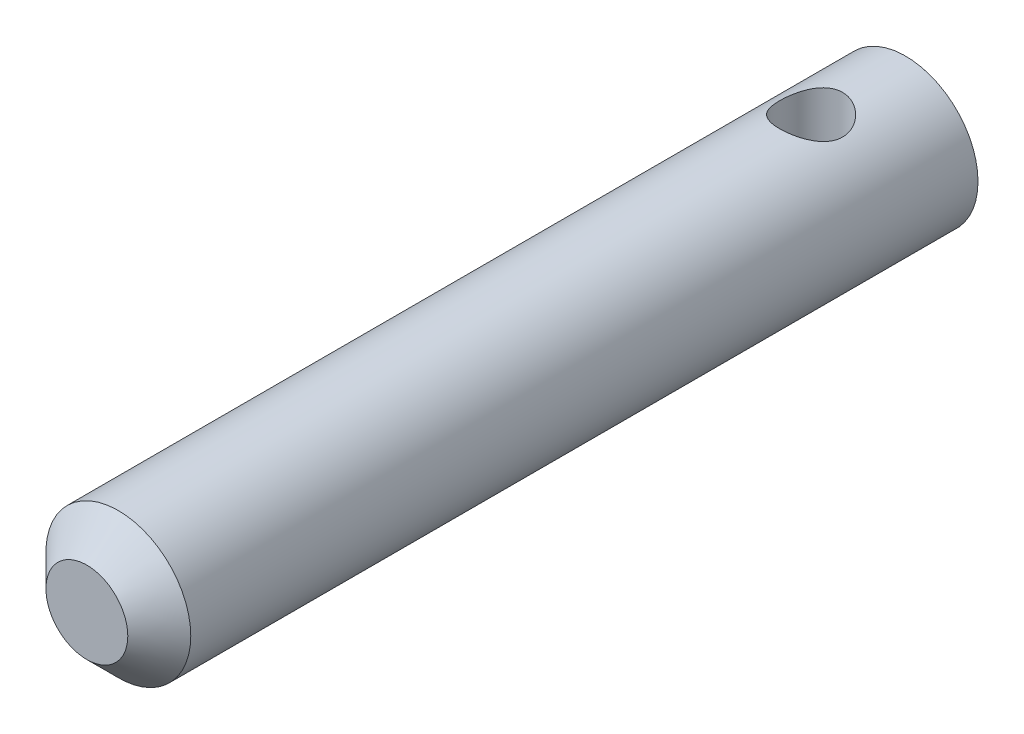
ISO-10303-21;
HEADER;
FILE_DESCRIPTION(('STEP AP214'),'2;1');
FILE_NAME('part.step','',(''),(''),'','','');
FILE_SCHEMA(('AUTOMOTIVE_DESIGN { 1 0 10303 214 1 1 1 1 }'));
ENDSEC;
DATA;
#1=APPLICATION_CONTEXT('core data for automotive mechanical design processes');
#2=APPLICATION_PROTOCOL_DEFINITION('international standard','automotive_design',2000,#1);
#3=PRODUCT_CONTEXT('',#1,'mechanical');
#4=PRODUCT('Part','Part','',(#3));
#5=PRODUCT_RELATED_PRODUCT_CATEGORY('part','',(#4));
#6=PRODUCT_DEFINITION_FORMATION('','',#4);
#7=PRODUCT_DEFINITION_CONTEXT('part definition',#1,'design');
#8=PRODUCT_DEFINITION('design','',#6,#7);
#9=PRODUCT_DEFINITION_SHAPE('','',#8);
#10=(LENGTH_UNIT() NAMED_UNIT(*) SI_UNIT(.MILLI.,.METRE.));
#11=(NAMED_UNIT(*) PLANE_ANGLE_UNIT() SI_UNIT($,.RADIAN.));
#12=(NAMED_UNIT(*) SI_UNIT($,.STERADIAN.) SOLID_ANGLE_UNIT());
#13=UNCERTAINTY_MEASURE_WITH_UNIT(LENGTH_MEASURE(1.E-05),#10,'distance_accuracy_value','');
#14=(GEOMETRIC_REPRESENTATION_CONTEXT(3) GLOBAL_UNCERTAINTY_ASSIGNED_CONTEXT((#13)) GLOBAL_UNIT_ASSIGNED_CONTEXT((#10,
#11,#12)) REPRESENTATION_CONTEXT('',''));
#15=CARTESIAN_POINT('',(0.,0.,0.));
#16=DIRECTION('',(0.,0.,1.));
#17=DIRECTION('',(1.,0.,0.));
#18=AXIS2_PLACEMENT_3D('',#15,#16,#17);
#19=CARTESIAN_POINT('',(0.,0.,130.));
#20=DIRECTION('',(0.,0.,-1.));
#21=DIRECTION('',(-1.,0.,0.));
#22=AXIS2_PLACEMENT_3D('',#19,#20,#21);
#23=CYLINDRICAL_SURFACE('',#22,11.5);
#24=CARTESIAN_POINT('',(0.,-11.5,20.));
#25=CARTESIAN_POINT('',(0.133458990074249,-11.4999991874002,19.9999990124654));
#26=CARTESIAN_POINT('',(0.266955948786075,-11.4976705721475,19.9946495135016));
#27=CARTESIAN_POINT('',(0.532992536445056,-11.4884139669808,19.9733032570884));
#28=CARTESIAN_POINT('',(0.665531550451407,-11.4814832492198,19.9573001848328));
#29=CARTESIAN_POINT('',(0.928868465690383,-11.4631869092443,19.9147760227048));
#30=CARTESIAN_POINT('',(1.05966248689034,-11.4518127026574,19.8882345721142));
#31=CARTESIAN_POINT('',(1.31835845187226,-11.4249225631695,19.8249017093118));
#32=CARTESIAN_POINT('',(1.44625919029645,-11.4094049373525,19.7881061071953));
#33=CARTESIAN_POINT('',(1.69777130312297,-11.3746919849332,19.7047897934512));
#34=CARTESIAN_POINT('',(1.8213976229545,-11.3555114250592,19.658308064039));
#35=CARTESIAN_POINT('',(2.06414861863617,-11.3139069713046,19.5559488470246));
#36=CARTESIAN_POINT('',(2.18327158872406,-11.2914818636876,19.5000678420183));
#37=CARTESIAN_POINT('',(2.53267560260701,-11.220154190515,19.3190527569011));
#38=CARTESIAN_POINT('',(2.75531587061131,-11.1671524513899,19.1804382981516));
#39=CARTESIAN_POINT('',(3.18549178683654,-11.0523644878927,18.8636267597276));
#40=CARTESIAN_POINT('',(3.39174967989157,-10.9902747829643,18.6838207856834));
#41=CARTESIAN_POINT('',(3.77240336462509,-10.8655004528371,18.2929199322887));
#42=CARTESIAN_POINT('',(3.94678096793641,-10.8028155093607,18.0818073154612));
#43=CARTESIAN_POINT('',(4.18546415335206,-10.7116625248013,17.7391163886916));
#44=CARTESIAN_POINT('',(4.26287209822216,-10.6810107227441,17.6170371861609));
#45=CARTESIAN_POINT('',(4.40705355558241,-10.6223314837564,17.3661735439366));
#46=CARTESIAN_POINT('',(4.47383149639632,-10.5943029560189,17.2373919262088));
#47=CARTESIAN_POINT('',(4.59617141764146,-10.5418047072696,16.9739080085057));
#48=CARTESIAN_POINT('',(4.65173319712871,-10.5173350500191,16.8392056025087));
#49=CARTESIAN_POINT('',(4.75104678414831,-10.4728466697121,16.5648696958721));
#50=CARTESIAN_POINT('',(4.79480484329122,-10.4528255915469,16.4252388499757));
#51=CARTESIAN_POINT('',(4.86812001807545,-10.4188750429802,16.149239351539));
#52=CARTESIAN_POINT('',(4.89828406502918,-10.4046884320125,16.0130635823662));
#53=CARTESIAN_POINT('',(4.94715913687101,-10.3815389352714,15.7382925110083));
#54=CARTESIAN_POINT('',(4.96587559740092,-10.3725735703977,15.5996983893309));
#55=CARTESIAN_POINT('',(4.9916291476955,-10.360204807105,15.3212246547683));
#56=CARTESIAN_POINT('',(4.99866992015354,-10.3567996549137,15.1813454612177));
#57=CARTESIAN_POINT('',(5.00098714496022,-10.3556810894788,14.9014710857784));
#58=CARTESIAN_POINT('',(4.99626430270702,-10.357967334954,14.7614759113475));
#59=CARTESIAN_POINT('',(4.97602372837784,-10.3677045133846,14.4944726643343));
#60=CARTESIAN_POINT('',(4.96145987176656,-10.3746988824398,14.3673741971675));
#61=CARTESIAN_POINT('',(4.92270111489017,-10.3931455313291,14.1149428344996));
#62=CARTESIAN_POINT('',(4.89850308945847,-10.404599257679,13.989610525584));
#63=CARTESIAN_POINT('',(4.8407276661514,-10.4316044342015,13.7416047134215));
#64=CARTESIAN_POINT('',(4.80715225317623,-10.4471550171581,13.6189306534213));
#65=CARTESIAN_POINT('',(4.73094055423751,-10.4818866616694,13.3769412508949));
#66=CARTESIAN_POINT('',(4.68830076163391,-10.5010691279373,13.257627228519));
#67=CARTESIAN_POINT('',(4.54525780340627,-10.5641703761196,12.9006739840788));
#68=CARTESIAN_POINT('',(4.43096553943128,-10.6130350109969,12.6693017955053));
#69=CARTESIAN_POINT('',(4.16929093341064,-10.7185281886957,12.2281901234645));
#70=CARTESIAN_POINT('',(4.02189494145437,-10.7751599304262,12.0184596158878));
#71=CARTESIAN_POINT('',(3.6821595110501,-10.8961990115413,11.6059538874166));
#72=CARTESIAN_POINT('',(3.48691870557135,-10.9608402281933,11.4056301937298));
#73=CARTESIAN_POINT('',(3.06488466164595,-11.086242856772,11.0396446235543));
#74=CARTESIAN_POINT('',(2.83808270466965,-11.1470031898439,10.8739923565566));
#75=CARTESIAN_POINT('',(2.47504570954992,-11.2312180411066,10.6531595213988));
#76=CARTESIAN_POINT('',(2.34834010998089,-11.2584559826855,10.5834064807259));
#77=CARTESIAN_POINT('',(2.08881378919834,-11.3094784666157,10.4549159252542));
#78=CARTESIAN_POINT('',(1.95599560108367,-11.3332644228198,10.3961738977104));
#79=CARTESIAN_POINT('',(1.68519695078808,-11.3766831075515,10.290302773071));
#80=CARTESIAN_POINT('',(1.5472178772898,-11.396316943997,10.2431705775478));
#81=CARTESIAN_POINT('',(1.26712004007569,-11.4308489354712,10.1610229379411));
#82=CARTESIAN_POINT('',(1.12500162387806,-11.4457474868065,10.1260064798427));
#83=CARTESIAN_POINT('',(0.847527611853476,-11.4695142968203,10.0704622167259));
#84=CARTESIAN_POINT('',(0.712364734435223,-11.4787222616754,10.0491146526161));
#85=CARTESIAN_POINT('',(0.440508170072177,-11.4923657418721,10.0175634424788));
#86=CARTESIAN_POINT('',(0.303814577112111,-11.4968015486147,10.0073591160142));
#87=CARTESIAN_POINT('',(0.0300171550236222,-11.5007756362991,9.99821461853187));
#88=CARTESIAN_POINT('',(-0.107086554619042,-11.5003152266704,9.99927143586755));
#89=CARTESIAN_POINT('',(-0.380638674291376,-11.4945129766706,10.0126294406182));
#90=CARTESIAN_POINT('',(-0.517087101273148,-11.4891712632697,10.0249303355576));
#91=CARTESIAN_POINT('',(-0.780740293947517,-11.474184326203,10.0596422398185));
#92=CARTESIAN_POINT('',(-0.908038764697128,-11.4647935875618,10.0814561547732));
#93=CARTESIAN_POINT('',(-1.16026535443806,-11.4420202038463,10.1347757534433));
#94=CARTESIAN_POINT('',(-1.28519269183145,-11.428636265989,10.1662845759513));
#95=CARTESIAN_POINT('',(-1.53180217395047,-11.3982018842603,10.2386885907299));
#96=CARTESIAN_POINT('',(-1.65348523922268,-11.3811524931607,10.2795810880982));
#97=CARTESIAN_POINT('',(-1.89293275463066,-11.3437879784756,10.3703964824361));
#98=CARTESIAN_POINT('',(-2.01069568986234,-11.3234716096763,10.420322823582));
#99=CARTESIAN_POINT('',(-2.36421123872549,-11.2569520308228,10.5864353815928));
#100=CARTESIAN_POINT('',(-2.5926551469904,-11.2061439851978,10.7167419900379));
#101=CARTESIAN_POINT('',(-3.02514032974193,-11.097227377648,11.0103882475502));
#102=CARTESIAN_POINT('',(-3.22917103110678,-11.0391156747594,11.1737421272509));
#103=CARTESIAN_POINT('',(-3.62381816565154,-10.916220154174,11.5436110830712));
#104=CARTESIAN_POINT('',(-3.81217300812063,-10.8512681011323,11.7524886298733));
#105=CARTESIAN_POINT('',(-4.15192368621724,-10.7258763801951,12.1999363364903));
#106=CARTESIAN_POINT('',(-4.30330818178984,-10.6654381007627,12.4385155730229));
#107=CARTESIAN_POINT('',(-4.50051999280747,-10.5830304458982,12.8168440342603));
#108=CARTESIAN_POINT('',(-4.56175038503632,-10.556709205411,12.947823840019));
#109=CARTESIAN_POINT('',(-4.67284041179974,-10.5080085191732,13.215206933922));
#110=CARTESIAN_POINT('',(-4.72270504386035,-10.4856273419657,13.3516078073189));
#111=CARTESIAN_POINT('',(-4.81050174389823,-10.4456403773525,13.6287948121452));
#112=CARTESIAN_POINT('',(-4.84844025871373,-10.4280320106454,13.7695785289708));
#113=CARTESIAN_POINT('',(-4.91195173062277,-10.3982674258466,14.0544738116267));
#114=CARTESIAN_POINT('',(-4.93752600056138,-10.386110628913,14.1985850224379));
#115=CARTESIAN_POINT('',(-4.97437987968876,-10.368506338256,14.4769279695011));
#116=CARTESIAN_POINT('',(-4.98666164667787,-10.3625895103155,14.6109981471189));
#117=CARTESIAN_POINT('',(-5.00036654643056,-10.3559835072615,14.8798183197157));
#118=CARTESIAN_POINT('',(-5.00179031886575,-10.355294024192,15.0145682741794));
#119=CARTESIAN_POINT('',(-4.99376218602584,-10.3591678351526,15.2836432651297));
#120=CARTESIAN_POINT('',(-4.9843121013154,-10.3637302498791,15.4179683689721));
#121=CARTESIAN_POINT('',(-4.95465826839781,-10.3779395959611,15.685149027287));
#122=CARTESIAN_POINT('',(-4.93445465678428,-10.3875864627327,15.8180046004038));
#123=CARTESIAN_POINT('',(-4.884943988929,-10.4109570669937,16.073943016582));
#124=CARTESIAN_POINT('',(-4.85620381101735,-10.4244250933553,16.1971592783056));
#125=CARTESIAN_POINT('',(-4.78962681942058,-10.4551810199209,16.4406336365376));
#126=CARTESIAN_POINT('',(-4.75178708661235,-10.4724701457834,16.560890770088));
#127=CARTESIAN_POINT('',(-4.62510393996686,-10.5293421414721,16.9161203028217));
#128=CARTESIAN_POINT('',(-4.52306237739788,-10.5739466586524,17.1457253310194));
#129=CARTESIAN_POINT('',(-4.27943987392404,-10.6749593518341,17.5993996301105));
#130=CARTESIAN_POINT('',(-4.1357771395402,-10.7319331527793,17.8222142421459));
#131=CARTESIAN_POINT('',(-3.81577872688308,-10.8498359898406,18.2418404535253));
#132=CARTESIAN_POINT('',(-3.63943017792797,-10.910766577858,18.4386417571386));
#133=CARTESIAN_POINT('',(-3.24172928984449,-11.0357566818621,18.8173965170969));
#134=CARTESIAN_POINT('',(-3.01786924299206,-11.0996617168069,18.9967998578271));
#135=CARTESIAN_POINT('',(-2.66050657356613,-11.188695373722,19.2358410293458));
#136=CARTESIAN_POINT('',(-2.53768075826109,-11.2172565380238,19.3105596383907));
#137=CARTESIAN_POINT('',(-2.28554894081294,-11.2713284621041,19.4493750246521));
#138=CARTESIAN_POINT('',(-2.1562459684374,-11.296840629524,19.513476708738));
#139=CARTESIAN_POINT('',(-1.89370361974128,-11.3437846065123,19.6297126451186));
#140=CARTESIAN_POINT('',(-1.76053626690972,-11.3652646784288,19.6819902219994));
#141=CARTESIAN_POINT('',(-1.48970271981609,-11.4039238565731,19.7750678057727));
#142=CARTESIAN_POINT('',(-1.35203871580326,-11.4211050224298,19.8158733101593));
#143=CARTESIAN_POINT('',(-1.07356590325531,-11.4506339217163,19.8854896009951));
#144=CARTESIAN_POINT('',(-0.932765585022724,-11.4629933431747,19.9143294035284));
#145=CARTESIAN_POINT('',(-0.648923328179211,-11.4825565568703,19.9597913274296));
#146=CARTESIAN_POINT('',(-0.505883051453298,-11.4897640020209,19.9764221056066));
#147=CARTESIAN_POINT('',(-0.302085196542317,-11.4961903098345,19.9912325371852));
#148=CARTESIAN_POINT('',(-0.241727014624067,-11.4976179452558,19.9945192027801));
#149=CARTESIAN_POINT('',(-0.120915153216626,-11.4995229783051,19.9989031668639));
#150=CARTESIAN_POINT('',(-0.060461472947857,-11.5000003681354,20.0000004473868));
#151=CARTESIAN_POINT('',(0.,-11.5,20.));
#152=B_SPLINE_CURVE_WITH_KNOTS('',3,(#24,#25,#26,#27,#28,#29,#30,#31,#32,#33,#34,#35,#36,#37,
#38,#39,#40,#41,#42,#43,#44,#45,#46,#47,#48,#49,#50,#51,#52,#53,#54,#55,#56,#57,#58,#59,#60,#61,
#62,#63,#64,#65,#66,#67,#68,#69,#70,#71,#72,#73,#74,#75,#76,#77,#78,#79,#80,#81,#82,#83,#84,#85,
#86,#87,#88,#89,#90,#91,#92,#93,#94,#95,#96,#97,#98,#99,#100,#101,#102,#103,#104,#105,#106,#107,
#108,#109,#110,#111,#112,#113,#114,#115,#116,#117,#118,#119,#120,#121,#122,#123,#124,#125,#126,
#127,#128,#129,#130,#131,#132,#133,#134,#135,#136,#137,#138,#139,#140,#141,#142,#143,#144,#145,
#146,#147,#148,#149,#150,#151),.UNSPECIFIED.,.T.,.F.,(4,2,2,2,2,2,2,2,2,2,2,2,2,2,2,2,2,2,2,2,2,
2,2,2,2,2,2,2,2,2,2,2,2,2,2,2,2,2,2,2,2,2,2,2,2,2,2,2,2,2,2,2,2,2,2,2,2,2,2,2,2,2,2,4),(0.,
0.400315984157242,0.800869463399182,1.20220062906734,1.60369602198393,2.00360575144468,
2.40366546975486,3.20276215683545,4.04108097881765,4.87987659665179,5.32271314983828,
5.76536473744629,6.20802425470872,6.65044886360297,7.07046867725525,7.49028889832948,
7.90997667638105,8.32963928871043,8.71355143834785,9.09758822439685,9.48154378337286,
9.86564815034256,10.650033535158,11.4347429472827,12.2922718711647,13.1500381529224,
13.5910935525788,14.0319677933091,14.4727242458924,14.9134438008604,15.3243552168486,
15.7352415400458,16.1460179797971,16.5567837349292,16.9448202571391,17.3329825412571,
17.7210334880627,18.1092326932183,18.9090979107847,19.7093082978572,20.5714732372136,
21.4339023004735,21.8742960358477,22.314495754883,22.7544571066529,23.1943717327215,
23.5981280823166,24.0018606454322,24.4055256231189,24.8091854734885,25.1904633733006,
25.5718637500234,26.3341347561794,27.1443093651105,27.9548036766005,28.8319183479002,
29.2711960420338,29.7102701433445,30.1436967081693,30.5769152166657,31.009076969052,
31.4409320003898,31.6222873022855,31.803644092362),.UNSPECIFIED.);
#153=CARTESIAN_POINT('',(0.,-11.5,20.));
#154=VERTEX_POINT('',#153);
#155=EDGE_CURVE('E10',#154,#154,#152,.T.);
#156=ORIENTED_EDGE('',*,*,#155,.T.);
#157=EDGE_LOOP('',(#156));
#158=FACE_BOUND('',#157,.T.);
#159=CARTESIAN_POINT('',(0.,11.5,20.));
#160=CARTESIAN_POINT('',(-0.133458990074249,11.4999991874002,19.9999990124654));
#161=CARTESIAN_POINT('',(-0.266955948786075,11.4976705721475,19.9946495135016));
#162=CARTESIAN_POINT('',(-0.532992536445056,11.4884139669808,19.9733032570884));
#163=CARTESIAN_POINT('',(-0.665531550451407,11.4814832492198,19.9573001848328));
#164=CARTESIAN_POINT('',(-0.928868465690383,11.4631869092443,19.9147760227048));
#165=CARTESIAN_POINT('',(-1.05966248689034,11.4518127026574,19.8882345721142));
#166=CARTESIAN_POINT('',(-1.31835845187226,11.4249225631695,19.8249017093118));
#167=CARTESIAN_POINT('',(-1.44625919029645,11.4094049373525,19.7881061071953));
#168=CARTESIAN_POINT('',(-1.69777130312297,11.3746919849332,19.7047897934512));
#169=CARTESIAN_POINT('',(-1.8213976229545,11.3555114250592,19.658308064039));
#170=CARTESIAN_POINT('',(-2.06414861863617,11.3139069713046,19.5559488470246));
#171=CARTESIAN_POINT('',(-2.18327158872406,11.2914818636876,19.5000678420183));
#172=CARTESIAN_POINT('',(-2.53267560260701,11.220154190515,19.3190527569011));
#173=CARTESIAN_POINT('',(-2.75531587061131,11.1671524513899,19.1804382981516));
#174=CARTESIAN_POINT('',(-3.18549178683654,11.0523644878927,18.8636267597276));
#175=CARTESIAN_POINT('',(-3.39174967989157,10.9902747829643,18.6838207856834));
#176=CARTESIAN_POINT('',(-3.77240336462509,10.8655004528371,18.2929199322887));
#177=CARTESIAN_POINT('',(-3.94678096793641,10.8028155093607,18.0818073154612));
#178=CARTESIAN_POINT('',(-4.18546415335206,10.7116625248013,17.7391163886916));
#179=CARTESIAN_POINT('',(-4.26287209822216,10.6810107227441,17.6170371861609));
#180=CARTESIAN_POINT('',(-4.40705355558241,10.6223314837564,17.3661735439366));
#181=CARTESIAN_POINT('',(-4.47383149639632,10.5943029560189,17.2373919262088));
#182=CARTESIAN_POINT('',(-4.59617141764146,10.5418047072696,16.9739080085057));
#183=CARTESIAN_POINT('',(-4.65173319712871,10.5173350500191,16.8392056025087));
#184=CARTESIAN_POINT('',(-4.75104678414831,10.4728466697121,16.5648696958721));
#185=CARTESIAN_POINT('',(-4.79480484329122,10.4528255915469,16.4252388499757));
#186=CARTESIAN_POINT('',(-4.86812001807545,10.4188750429802,16.149239351539));
#187=CARTESIAN_POINT('',(-4.89828406502918,10.4046884320125,16.0130635823662));
#188=CARTESIAN_POINT('',(-4.94715913687101,10.3815389352714,15.7382925110083));
#189=CARTESIAN_POINT('',(-4.96587559740092,10.3725735703977,15.5996983893309));
#190=CARTESIAN_POINT('',(-4.9916291476955,10.360204807105,15.3212246547683));
#191=CARTESIAN_POINT('',(-4.99866992015354,10.3567996549137,15.1813454612177));
#192=CARTESIAN_POINT('',(-5.00098714496022,10.3556810894788,14.9014710857784));
#193=CARTESIAN_POINT('',(-4.99626430270702,10.357967334954,14.7614759113475));
#194=CARTESIAN_POINT('',(-4.97602372837784,10.3677045133846,14.4944726643343));
#195=CARTESIAN_POINT('',(-4.96145987176656,10.3746988824398,14.3673741971675));
#196=CARTESIAN_POINT('',(-4.92270111489017,10.3931455313291,14.1149428344996));
#197=CARTESIAN_POINT('',(-4.89850308945847,10.404599257679,13.989610525584));
#198=CARTESIAN_POINT('',(-4.8407276661514,10.4316044342015,13.7416047134215));
#199=CARTESIAN_POINT('',(-4.80715225317623,10.4471550171581,13.6189306534213));
#200=CARTESIAN_POINT('',(-4.73094055423751,10.4818866616694,13.3769412508949));
#201=CARTESIAN_POINT('',(-4.68830076163391,10.5010691279373,13.257627228519));
#202=CARTESIAN_POINT('',(-4.54525780340627,10.5641703761196,12.9006739840788));
#203=CARTESIAN_POINT('',(-4.43096553943128,10.6130350109969,12.6693017955053));
#204=CARTESIAN_POINT('',(-4.16929093341064,10.7185281886957,12.2281901234645));
#205=CARTESIAN_POINT('',(-4.02189494145437,10.7751599304262,12.0184596158878));
#206=CARTESIAN_POINT('',(-3.6821595110501,10.8961990115413,11.6059538874166));
#207=CARTESIAN_POINT('',(-3.48691870557135,10.9608402281933,11.4056301937298));
#208=CARTESIAN_POINT('',(-3.06488466164595,11.086242856772,11.0396446235543));
#209=CARTESIAN_POINT('',(-2.83808270466965,11.1470031898439,10.8739923565566));
#210=CARTESIAN_POINT('',(-2.47504570954992,11.2312180411066,10.6531595213988));
#211=CARTESIAN_POINT('',(-2.34834010998089,11.2584559826855,10.5834064807259));
#212=CARTESIAN_POINT('',(-2.08881378919834,11.3094784666157,10.4549159252542));
#213=CARTESIAN_POINT('',(-1.95599560108367,11.3332644228198,10.3961738977104));
#214=CARTESIAN_POINT('',(-1.68519695078808,11.3766831075515,10.290302773071));
#215=CARTESIAN_POINT('',(-1.5472178772898,11.396316943997,10.2431705775478));
#216=CARTESIAN_POINT('',(-1.26712004007569,11.4308489354712,10.1610229379411));
#217=CARTESIAN_POINT('',(-1.12500162387806,11.4457474868065,10.1260064798427));
#218=CARTESIAN_POINT('',(-0.847527611853476,11.4695142968203,10.0704622167259));
#219=CARTESIAN_POINT('',(-0.712364734435223,11.4787222616754,10.0491146526161));
#220=CARTESIAN_POINT('',(-0.440508170072177,11.4923657418721,10.0175634424788));
#221=CARTESIAN_POINT('',(-0.303814577112111,11.4968015486147,10.0073591160142));
#222=CARTESIAN_POINT('',(-0.0300171550236222,11.5007756362991,9.99821461853187));
#223=CARTESIAN_POINT('',(0.107086554619042,11.5003152266704,9.99927143586755));
#224=CARTESIAN_POINT('',(0.380638674291376,11.4945129766706,10.0126294406182));
#225=CARTESIAN_POINT('',(0.517087101273148,11.4891712632697,10.0249303355576));
#226=CARTESIAN_POINT('',(0.780740293947517,11.474184326203,10.0596422398185));
#227=CARTESIAN_POINT('',(0.908038764697128,11.4647935875618,10.0814561547732));
#228=CARTESIAN_POINT('',(1.16026535443806,11.4420202038463,10.1347757534433));
#229=CARTESIAN_POINT('',(1.28519269183145,11.428636265989,10.1662845759513));
#230=CARTESIAN_POINT('',(1.53180217395047,11.3982018842603,10.2386885907299));
#231=CARTESIAN_POINT('',(1.65348523922268,11.3811524931607,10.2795810880982));
#232=CARTESIAN_POINT('',(1.89293275463066,11.3437879784756,10.3703964824361));
#233=CARTESIAN_POINT('',(2.01069568986234,11.3234716096763,10.420322823582));
#234=CARTESIAN_POINT('',(2.36421123872549,11.2569520308228,10.5864353815928));
#235=CARTESIAN_POINT('',(2.5926551469904,11.2061439851978,10.7167419900379));
#236=CARTESIAN_POINT('',(3.02514032974193,11.097227377648,11.0103882475502));
#237=CARTESIAN_POINT('',(3.22917103110678,11.0391156747594,11.1737421272509));
#238=CARTESIAN_POINT('',(3.62381816565154,10.916220154174,11.5436110830712));
#239=CARTESIAN_POINT('',(3.81217300812063,10.8512681011323,11.7524886298733));
#240=CARTESIAN_POINT('',(4.15192368621724,10.7258763801951,12.1999363364903));
#241=CARTESIAN_POINT('',(4.30330818178984,10.6654381007627,12.4385155730229));
#242=CARTESIAN_POINT('',(4.50051999280747,10.5830304458982,12.8168440342603));
#243=CARTESIAN_POINT('',(4.56175038503632,10.556709205411,12.947823840019));
#244=CARTESIAN_POINT('',(4.67284041179974,10.5080085191732,13.215206933922));
#245=CARTESIAN_POINT('',(4.72270504386035,10.4856273419657,13.3516078073189));
#246=CARTESIAN_POINT('',(4.81050174389823,10.4456403773525,13.6287948121452));
#247=CARTESIAN_POINT('',(4.84844025871373,10.4280320106454,13.7695785289708));
#248=CARTESIAN_POINT('',(4.91195173062277,10.3982674258466,14.0544738116267));
#249=CARTESIAN_POINT('',(4.93752600056138,10.386110628913,14.1985850224379));
#250=CARTESIAN_POINT('',(4.97437987968876,10.368506338256,14.4769279695011));
#251=CARTESIAN_POINT('',(4.98666164667787,10.3625895103155,14.6109981471189));
#252=CARTESIAN_POINT('',(5.00036654643056,10.3559835072615,14.8798183197157));
#253=CARTESIAN_POINT('',(5.00179031886575,10.355294024192,15.0145682741794));
#254=CARTESIAN_POINT('',(4.99376218602584,10.3591678351526,15.2836432651297));
#255=CARTESIAN_POINT('',(4.9843121013154,10.3637302498791,15.4179683689721));
#256=CARTESIAN_POINT('',(4.95465826839781,10.3779395959611,15.685149027287));
#257=CARTESIAN_POINT('',(4.93445465678428,10.3875864627327,15.8180046004038));
#258=CARTESIAN_POINT('',(4.884943988929,10.4109570669937,16.073943016582));
#259=CARTESIAN_POINT('',(4.85620381101735,10.4244250933553,16.1971592783056));
#260=CARTESIAN_POINT('',(4.78962681942058,10.4551810199209,16.4406336365376));
#261=CARTESIAN_POINT('',(4.75178708661235,10.4724701457834,16.560890770088));
#262=CARTESIAN_POINT('',(4.62510393996686,10.5293421414721,16.9161203028217));
#263=CARTESIAN_POINT('',(4.52306237739788,10.5739466586524,17.1457253310194));
#264=CARTESIAN_POINT('',(4.27943987392404,10.6749593518341,17.5993996301105));
#265=CARTESIAN_POINT('',(4.1357771395402,10.7319331527793,17.8222142421459));
#266=CARTESIAN_POINT('',(3.81577872688308,10.8498359898406,18.2418404535253));
#267=CARTESIAN_POINT('',(3.63943017792797,10.910766577858,18.4386417571386));
#268=CARTESIAN_POINT('',(3.24172928984449,11.0357566818621,18.8173965170969));
#269=CARTESIAN_POINT('',(3.01786924299206,11.0996617168069,18.9967998578271));
#270=CARTESIAN_POINT('',(2.66050657356613,11.188695373722,19.2358410293458));
#271=CARTESIAN_POINT('',(2.53768075826109,11.2172565380238,19.3105596383907));
#272=CARTESIAN_POINT('',(2.28554894081294,11.2713284621041,19.4493750246521));
#273=CARTESIAN_POINT('',(2.1562459684374,11.296840629524,19.513476708738));
#274=CARTESIAN_POINT('',(1.89370361974128,11.3437846065123,19.6297126451186));
#275=CARTESIAN_POINT('',(1.76053626690972,11.3652646784288,19.6819902219994));
#276=CARTESIAN_POINT('',(1.48970271981609,11.4039238565731,19.7750678057727));
#277=CARTESIAN_POINT('',(1.35203871580326,11.4211050224298,19.8158733101593));
#278=CARTESIAN_POINT('',(1.07356590325531,11.4506339217163,19.8854896009951));
#279=CARTESIAN_POINT('',(0.932765585022724,11.4629933431747,19.9143294035284));
#280=CARTESIAN_POINT('',(0.648923328179211,11.4825565568703,19.9597913274296));
#281=CARTESIAN_POINT('',(0.505883051453298,11.4897640020209,19.9764221056066));
#282=CARTESIAN_POINT('',(0.302085196542317,11.4961903098345,19.9912325371852));
#283=CARTESIAN_POINT('',(0.241727014624067,11.4976179452558,19.9945192027801));
#284=CARTESIAN_POINT('',(0.120915153216626,11.4995229783051,19.9989031668639));
#285=CARTESIAN_POINT('',(0.060461472947857,11.5000003681354,20.0000004473868));
#286=CARTESIAN_POINT('',(0.,11.5,20.));
#287=B_SPLINE_CURVE_WITH_KNOTS('',3,(#159,#160,#161,#162,#163,#164,#165,#166,#167,#168,#169,
#170,#171,#172,#173,#174,#175,#176,#177,#178,#179,#180,#181,#182,#183,#184,#185,#186,#187,#188,
#189,#190,#191,#192,#193,#194,#195,#196,#197,#198,#199,#200,#201,#202,#203,#204,#205,#206,#207,
#208,#209,#210,#211,#212,#213,#214,#215,#216,#217,#218,#219,#220,#221,#222,#223,#224,#225,#226,
#227,#228,#229,#230,#231,#232,#233,#234,#235,#236,#237,#238,#239,#240,#241,#242,#243,#244,#245,
#246,#247,#248,#249,#250,#251,#252,#253,#254,#255,#256,#257,#258,#259,#260,#261,#262,#263,#264,
#265,#266,#267,#268,#269,#270,#271,#272,#273,#274,#275,#276,#277,#278,#279,#280,#281,#282,#283,
#284,#285,#286),.UNSPECIFIED.,.T.,.F.,(4,2,2,2,2,2,2,2,2,2,2,2,2,2,2,2,2,2,2,2,2,2,2,2,2,2,2,2,
2,2,2,2,2,2,2,2,2,2,2,2,2,2,2,2,2,2,2,2,2,2,2,2,2,2,2,2,2,2,2,2,2,2,2,4),(0.,0.400315984157242,
0.800869463399182,1.20220062906734,1.60369602198393,2.00360575144468,2.40366546975486,
3.20276215683545,4.04108097881765,4.87987659665179,5.32271314983828,5.76536473744629,
6.20802425470872,6.65044886360297,7.07046867725525,7.49028889832948,7.90997667638105,
8.32963928871043,8.71355143834785,9.09758822439685,9.48154378337286,9.86564815034256,
10.650033535158,11.4347429472827,12.2922718711647,13.1500381529224,13.5910935525788,
14.0319677933091,14.4727242458924,14.9134438008604,15.3243552168486,15.7352415400458,
16.1460179797971,16.5567837349292,16.9448202571391,17.3329825412571,17.7210334880627,
18.1092326932183,18.9090979107847,19.7093082978572,20.5714732372136,21.4339023004735,
21.8742960358477,22.314495754883,22.7544571066529,23.1943717327215,23.5981280823166,
24.0018606454322,24.4055256231189,24.8091854734885,25.1904633733006,25.5718637500234,
26.3341347561794,27.1443093651105,27.9548036766005,28.8319183479002,29.2711960420338,
29.7102701433445,30.1436967081693,30.5769152166657,31.009076969052,31.4409320003898,
31.6222873022855,31.803644092362),.UNSPECIFIED.);
#288=CARTESIAN_POINT('',(0.,11.5,20.));
#289=VERTEX_POINT('',#288);
#290=EDGE_CURVE('E45',#289,#289,#287,.T.);
#291=ORIENTED_EDGE('',*,*,#290,.T.);
#292=EDGE_LOOP('',(#291));
#293=FACE_BOUND('',#292,.T.);
#294=CARTESIAN_POINT('',(0.,0.,125.));
#295=DIRECTION('',(0.,0.,1.));
#296=DIRECTION('',(1.,0.,0.));
#297=AXIS2_PLACEMENT_3D('',#294,#295,#296);
#298=CIRCLE('',#297,11.5);
#299=CARTESIAN_POINT('',(11.5,0.,125.));
#300=VERTEX_POINT('',#299);
#301=EDGE_CURVE('E49',#300,#300,#298,.F.);
#302=ORIENTED_EDGE('',*,*,#301,.T.);
#303=EDGE_LOOP('',(#302));
#304=FACE_BOUND('',#303,.T.);
#305=CARTESIAN_POINT('',(0.,0.,0.));
#306=DIRECTION('',(0.,0.,1.));
#307=DIRECTION('',(1.,0.,0.));
#308=AXIS2_PLACEMENT_3D('',#305,#306,#307);
#309=CIRCLE('',#308,11.5);
#310=CARTESIAN_POINT('',(11.5,0.,0.));
#311=VERTEX_POINT('',#310);
#312=EDGE_CURVE('E87',#311,#311,#309,.T.);
#313=ORIENTED_EDGE('',*,*,#312,.T.);
#314=EDGE_LOOP('',(#313));
#315=FACE_BOUND('',#314,.T.);
#316=ADVANCED_FACE('F33',(#158,#293,#304,#315),#23,.T.);
#317=CARTESIAN_POINT('',(0.,0.,130.));
#318=DIRECTION('',(0.,0.,1.));
#319=DIRECTION('',(1.,0.,0.));
#320=AXIS2_PLACEMENT_3D('',#317,#318,#319);
#321=PLANE('',#320);
#322=CARTESIAN_POINT('',(0.,0.,130.));
#323=DIRECTION('',(0.,0.,1.));
#324=DIRECTION('',(1.,0.,0.));
#325=AXIS2_PLACEMENT_3D('',#322,#323,#324);
#326=CIRCLE('',#325,6.49999999999999);
#327=CARTESIAN_POINT('',(6.49999999999999,0.,130.));
#328=VERTEX_POINT('',#327);
#329=EDGE_CURVE('E53',#328,#328,#326,.T.);
#330=ORIENTED_EDGE('',*,*,#329,.T.);
#331=EDGE_LOOP('',(#330));
#332=FACE_BOUND('',#331,.T.);
#333=ADVANCED_FACE('F66',(#332),#321,.T.);
#334=CARTESIAN_POINT('',(0.,0.,0.));
#335=DIRECTION('',(0.,0.,1.));
#336=DIRECTION('',(1.,0.,0.));
#337=AXIS2_PLACEMENT_3D('',#334,#335,#336);
#338=PLANE('',#337);
#339=ORIENTED_EDGE('',*,*,#312,.F.);
#340=EDGE_LOOP('',(#339));
#341=FACE_BOUND('',#340,.T.);
#342=ADVANCED_FACE('F69',(#341),#338,.F.);
#343=CARTESIAN_POINT('',(0.,0.,130.));
#344=DIRECTION('',(0.,0.,-1.));
#345=DIRECTION('',(-1.,0.,0.));
#346=AXIS2_PLACEMENT_3D('',#343,#344,#345);
#347=CONICAL_SURFACE('',#346,6.49999999999999,0.785398163397446);
#348=ORIENTED_EDGE('',*,*,#301,.F.);
#349=EDGE_LOOP('',(#348));
#350=FACE_BOUND('',#349,.T.);
#351=ORIENTED_EDGE('',*,*,#329,.F.);
#352=EDGE_LOOP('',(#351));
#353=FACE_BOUND('',#352,.T.);
#354=ADVANCED_FACE('F36',(#350,#353),#347,.T.);
#355=CARTESIAN_POINT('',(0.,-11.5,15.));
#356=DIRECTION('',(0.,1.,0.));
#357=DIRECTION('',(0.,0.,1.));
#358=AXIS2_PLACEMENT_3D('',#355,#356,#357);
#359=CYLINDRICAL_SURFACE('',#358,5.);
#360=ORIENTED_EDGE('',*,*,#290,.F.);
#361=EDGE_LOOP('',(#360));
#362=FACE_BOUND('',#361,.T.);
#363=ORIENTED_EDGE('',*,*,#155,.F.);
#364=EDGE_LOOP('',(#363));
#365=FACE_BOUND('',#364,.T.);
#366=ADVANCED_FACE('F61',(#362,#365),#359,.F.);
#367=CLOSED_SHELL('',(#316,#333,#342,#354,#366));
#368=MANIFOLD_SOLID_BREP('B2',#367);
#369=ADVANCED_BREP_SHAPE_REPRESENTATION('',(#18,#368),#14);
#370=SHAPE_DEFINITION_REPRESENTATION(#9,#369);
ENDSEC;
END-ISO-10303-21;
